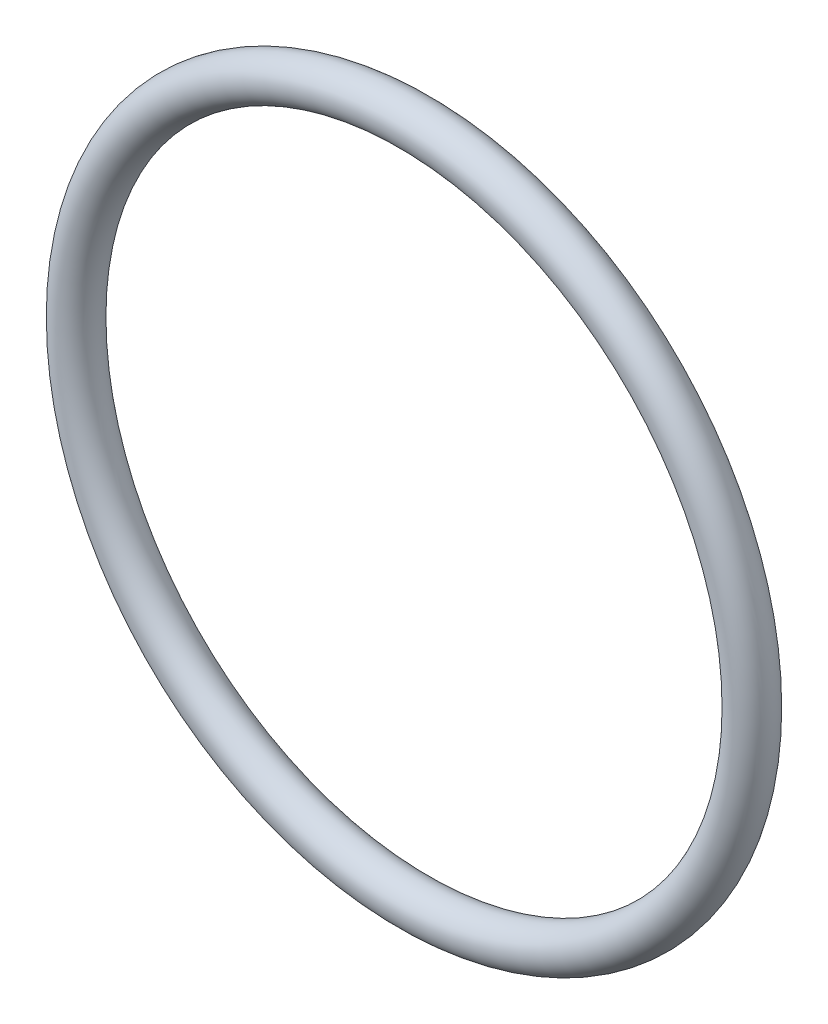
ISO-10303-21;
HEADER;
FILE_DESCRIPTION(('STEP AP214'),'2;1');
FILE_NAME('part.step','',(''),(''),'','','');
FILE_SCHEMA(('AUTOMOTIVE_DESIGN { 1 0 10303 214 1 1 1 1 }'));
ENDSEC;
DATA;
#1=APPLICATION_CONTEXT('core data for automotive mechanical design processes');
#2=APPLICATION_PROTOCOL_DEFINITION('international standard','automotive_design',2000,#1);
#3=PRODUCT_CONTEXT('',#1,'mechanical');
#4=PRODUCT('Part','Part','',(#3));
#5=PRODUCT_RELATED_PRODUCT_CATEGORY('part','',(#4));
#6=PRODUCT_DEFINITION_FORMATION('','',#4);
#7=PRODUCT_DEFINITION_CONTEXT('part definition',#1,'design');
#8=PRODUCT_DEFINITION('design','',#6,#7);
#9=PRODUCT_DEFINITION_SHAPE('','',#8);
#10=(LENGTH_UNIT() NAMED_UNIT(*) SI_UNIT(.MILLI.,.METRE.));
#11=(NAMED_UNIT(*) PLANE_ANGLE_UNIT() SI_UNIT($,.RADIAN.));
#12=(NAMED_UNIT(*) SI_UNIT($,.STERADIAN.) SOLID_ANGLE_UNIT());
#13=UNCERTAINTY_MEASURE_WITH_UNIT(LENGTH_MEASURE(1.E-05),#10,'distance_accuracy_value','');
#14=(GEOMETRIC_REPRESENTATION_CONTEXT(3) GLOBAL_UNCERTAINTY_ASSIGNED_CONTEXT((#13)) GLOBAL_UNIT_ASSIGNED_CONTEXT((#10,
#11,#12)) REPRESENTATION_CONTEXT('',''));
#15=CARTESIAN_POINT('',(0.,0.,0.));
#16=DIRECTION('',(0.,0.,1.));
#17=DIRECTION('',(1.,0.,0.));
#18=AXIS2_PLACEMENT_3D('',#15,#16,#17);
#19=CARTESIAN_POINT('',(0.,0.,0.));
#20=DIRECTION('',(0.,0.,1.));
#21=DIRECTION('',(1.,0.,0.));
#22=AXIS2_PLACEMENT_3D('',#19,#20,#21);
#23=TOROIDAL_SURFACE('',#22,14.2367,0.888999999999998);
#24=CARTESIAN_POINT('',(15.1257,0.,0.));
#25=VERTEX_POINT('',#24);
#26=VERTEX_LOOP('',#25);
#27=FACE_BOUND('',#26,.T.);
#28=ADVANCED_FACE('F26',(#27),#23,.T.);
#29=CLOSED_SHELL('',(#28));
#30=MANIFOLD_SOLID_BREP('B2',#29);
#31=ADVANCED_BREP_SHAPE_REPRESENTATION('',(#18,#30),#14);
#32=SHAPE_DEFINITION_REPRESENTATION(#9,#31);
ENDSEC;
END-ISO-10303-21;
